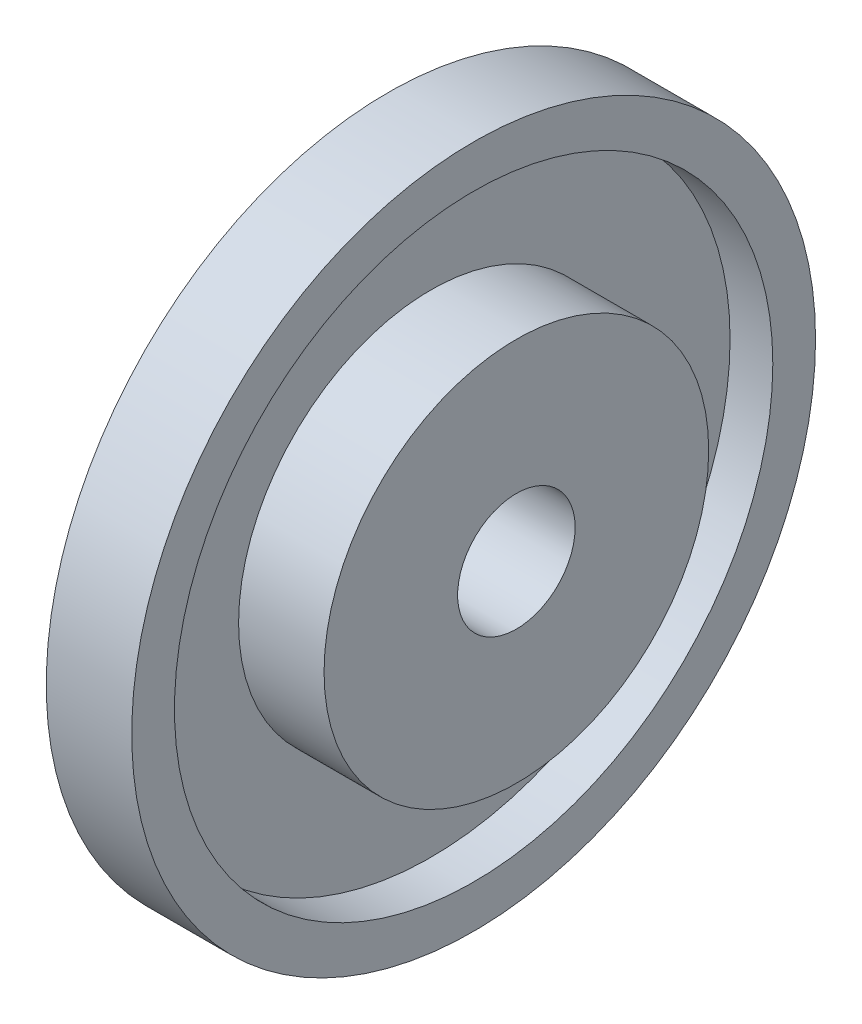
ISO-10303-21;
HEADER;
FILE_DESCRIPTION(('STEP AP214'),'2;1');
FILE_NAME('part.step','',(''),(''),'','','');
FILE_SCHEMA(('AUTOMOTIVE_DESIGN { 1 0 10303 214 1 1 1 1 }'));
ENDSEC;
DATA;
#1=APPLICATION_CONTEXT('core data for automotive mechanical design processes');
#2=APPLICATION_PROTOCOL_DEFINITION('international standard','automotive_design',2000,#1);
#3=PRODUCT_CONTEXT('',#1,'mechanical');
#4=PRODUCT('Part','Part','',(#3));
#5=PRODUCT_RELATED_PRODUCT_CATEGORY('part','',(#4));
#6=PRODUCT_DEFINITION_FORMATION('','',#4);
#7=PRODUCT_DEFINITION_CONTEXT('part definition',#1,'design');
#8=PRODUCT_DEFINITION('design','',#6,#7);
#9=PRODUCT_DEFINITION_SHAPE('','',#8);
#10=(LENGTH_UNIT() NAMED_UNIT(*) SI_UNIT(.MILLI.,.METRE.));
#11=(NAMED_UNIT(*) PLANE_ANGLE_UNIT() SI_UNIT($,.RADIAN.));
#12=(NAMED_UNIT(*) SI_UNIT($,.STERADIAN.) SOLID_ANGLE_UNIT());
#13=UNCERTAINTY_MEASURE_WITH_UNIT(LENGTH_MEASURE(1.E-05),#10,'distance_accuracy_value','');
#14=(GEOMETRIC_REPRESENTATION_CONTEXT(3) GLOBAL_UNCERTAINTY_ASSIGNED_CONTEXT((#13)) GLOBAL_UNIT_ASSIGNED_CONTEXT((#10,
#11,#12)) REPRESENTATION_CONTEXT('',''));
#15=CARTESIAN_POINT('',(0.,0.,0.));
#16=DIRECTION('',(0.,0.,1.));
#17=DIRECTION('',(1.,0.,0.));
#18=AXIS2_PLACEMENT_3D('',#15,#16,#17);
#19=CARTESIAN_POINT('',(2.,0.,0.));
#20=DIRECTION('',(1.,0.,0.));
#21=DIRECTION('',(0.,0.,-1.));
#22=AXIS2_PLACEMENT_3D('',#19,#20,#21);
#23=PLANE('',#22);
#24=CARTESIAN_POINT('',(2.,0.,0.));
#25=DIRECTION('',(1.,0.,0.));
#26=DIRECTION('',(0.,0.,-1.));
#27=AXIS2_PLACEMENT_3D('',#24,#25,#26);
#28=CIRCLE('',#27,9.);
#29=CARTESIAN_POINT('',(2.,0.,-9.));
#30=VERTEX_POINT('',#29);
#31=EDGE_CURVE('E53',#30,#30,#28,.T.);
#32=ORIENTED_EDGE('',*,*,#31,.F.);
#33=EDGE_LOOP('',(#32));
#34=FACE_BOUND('',#33,.T.);
#35=CARTESIAN_POINT('',(2.,0.,0.));
#36=DIRECTION('',(1.,0.,0.));
#37=DIRECTION('',(0.,0.,-1.));
#38=AXIS2_PLACEMENT_3D('',#35,#36,#37);
#39=CIRCLE('',#38,14.);
#40=CARTESIAN_POINT('',(2.,0.,-14.));
#41=VERTEX_POINT('',#40);
#42=EDGE_CURVE('E58',#41,#41,#39,.F.);
#43=ORIENTED_EDGE('',*,*,#42,.F.);
#44=EDGE_LOOP('',(#43));
#45=FACE_BOUND('',#44,.T.);
#46=ADVANCED_FACE('F39',(#34,#45),#23,.T.);
#47=CARTESIAN_POINT('',(0.,0.,0.));
#48=DIRECTION('',(1.,0.,0.));
#49=DIRECTION('',(0.,0.,-1.));
#50=AXIS2_PLACEMENT_3D('',#47,#48,#49);
#51=PLANE('',#50);
#52=CARTESIAN_POINT('',(0.,0.,0.));
#53=DIRECTION('',(1.,0.,0.));
#54=DIRECTION('',(0.,0.,-1.));
#55=AXIS2_PLACEMENT_3D('',#52,#53,#54);
#56=CIRCLE('',#55,6.21410161513776);
#57=CARTESIAN_POINT('',(0.,0.,-6.21410161513776));
#58=VERTEX_POINT('',#57);
#59=EDGE_CURVE('E48',#58,#58,#56,.T.);
#60=ORIENTED_EDGE('',*,*,#59,.T.);
#61=EDGE_LOOP('',(#60));
#62=FACE_BOUND('',#61,.T.);
#63=CARTESIAN_POINT('',(0.,0.,0.));
#64=DIRECTION('',(1.,0.,0.));
#65=DIRECTION('',(0.,0.,-1.));
#66=AXIS2_PLACEMENT_3D('',#63,#64,#65);
#67=CIRCLE('',#66,16.);
#68=CARTESIAN_POINT('',(0.,0.,-16.));
#69=VERTEX_POINT('',#68);
#70=EDGE_CURVE('E65',#69,#69,#67,.T.);
#71=ORIENTED_EDGE('',*,*,#70,.F.);
#72=EDGE_LOOP('',(#71));
#73=FACE_BOUND('',#72,.T.);
#74=ADVANCED_FACE('F103',(#62,#73),#51,.F.);
#75=CARTESIAN_POINT('',(4.,0.,0.));
#76=DIRECTION('',(-1.,0.,0.));
#77=DIRECTION('',(0.,0.,1.));
#78=AXIS2_PLACEMENT_3D('',#75,#76,#77);
#79=CYLINDRICAL_SURFACE('',#78,14.);
#80=ORIENTED_EDGE('',*,*,#42,.T.);
#81=EDGE_LOOP('',(#80));
#82=FACE_BOUND('',#81,.T.);
#83=CARTESIAN_POINT('',(4.,0.,0.));
#84=DIRECTION('',(1.,0.,0.));
#85=DIRECTION('',(0.,0.,-1.));
#86=AXIS2_PLACEMENT_3D('',#83,#84,#85);
#87=CIRCLE('',#86,14.);
#88=CARTESIAN_POINT('',(4.,0.,-14.));
#89=VERTEX_POINT('',#88);
#90=EDGE_CURVE('E69',#89,#89,#87,.T.);
#91=ORIENTED_EDGE('',*,*,#90,.T.);
#92=EDGE_LOOP('',(#91));
#93=FACE_BOUND('',#92,.T.);
#94=ADVANCED_FACE('F109',(#82,#93),#79,.F.);
#95=CARTESIAN_POINT('',(4.,0.,0.));
#96=DIRECTION('',(-1.,0.,0.));
#97=DIRECTION('',(0.,0.,1.));
#98=AXIS2_PLACEMENT_3D('',#95,#96,#97);
#99=CYLINDRICAL_SURFACE('',#98,16.);
#100=CARTESIAN_POINT('',(4.,0.,0.));
#101=DIRECTION('',(1.,0.,0.));
#102=DIRECTION('',(0.,0.,-1.));
#103=AXIS2_PLACEMENT_3D('',#100,#101,#102);
#104=CIRCLE('',#103,16.);
#105=CARTESIAN_POINT('',(4.,0.,-16.));
#106=VERTEX_POINT('',#105);
#107=EDGE_CURVE('E64',#106,#106,#104,.T.);
#108=ORIENTED_EDGE('',*,*,#107,.F.);
#109=EDGE_LOOP('',(#108));
#110=FACE_BOUND('',#109,.T.);
#111=ORIENTED_EDGE('',*,*,#70,.T.);
#112=EDGE_LOOP('',(#111));
#113=FACE_BOUND('',#112,.T.);
#114=ADVANCED_FACE('F115',(#110,#113),#99,.T.);
#115=CARTESIAN_POINT('',(4.,0.,0.));
#116=DIRECTION('',(1.,0.,0.));
#117=DIRECTION('',(0.,0.,-1.));
#118=AXIS2_PLACEMENT_3D('',#115,#116,#117);
#119=PLANE('',#118);
#120=ORIENTED_EDGE('',*,*,#90,.F.);
#121=EDGE_LOOP('',(#120));
#122=FACE_BOUND('',#121,.T.);
#123=ORIENTED_EDGE('',*,*,#107,.T.);
#124=EDGE_LOOP('',(#123));
#125=FACE_BOUND('',#124,.T.);
#126=ADVANCED_FACE('F100',(#122,#125),#119,.T.);
#127=CARTESIAN_POINT('',(6.,0.,0.));
#128=DIRECTION('',(-1.,0.,0.));
#129=DIRECTION('',(0.,0.,1.));
#130=AXIS2_PLACEMENT_3D('',#127,#128,#129);
#131=CYLINDRICAL_SURFACE('',#130,2.75);
#132=CARTESIAN_POINT('',(2.00000000000001,0.,0.));
#133=DIRECTION('',(1.,0.,0.));
#134=DIRECTION('',(0.,0.,-1.));
#135=AXIS2_PLACEMENT_3D('',#132,#133,#134);
#136=CIRCLE('',#135,2.75);
#137=CARTESIAN_POINT('',(2.00000000000001,0.,-2.75));
#138=VERTEX_POINT('',#137);
#139=EDGE_CURVE('E10',#138,#138,#136,.F.);
#140=ORIENTED_EDGE('',*,*,#139,.T.);
#141=EDGE_LOOP('',(#140));
#142=FACE_BOUND('',#141,.T.);
#143=CARTESIAN_POINT('',(6.,0.,0.));
#144=DIRECTION('',(1.,0.,0.));
#145=DIRECTION('',(0.,0.,-1.));
#146=AXIS2_PLACEMENT_3D('',#143,#144,#145);
#147=CIRCLE('',#146,2.75);
#148=CARTESIAN_POINT('',(6.,0.,-2.75));
#149=VERTEX_POINT('',#148);
#150=EDGE_CURVE('E80',#149,#149,#147,.T.);
#151=ORIENTED_EDGE('',*,*,#150,.T.);
#152=EDGE_LOOP('',(#151));
#153=FACE_BOUND('',#152,.T.);
#154=ADVANCED_FACE('F85',(#142,#153),#131,.F.);
#155=CARTESIAN_POINT('',(6.,0.,0.));
#156=DIRECTION('',(-1.,0.,0.));
#157=DIRECTION('',(0.,0.,1.));
#158=AXIS2_PLACEMENT_3D('',#155,#156,#157);
#159=CYLINDRICAL_SURFACE('',#158,9.);
#160=ORIENTED_EDGE('',*,*,#31,.T.);
#161=EDGE_LOOP('',(#160));
#162=FACE_BOUND('',#161,.T.);
#163=CARTESIAN_POINT('',(6.,0.,0.));
#164=DIRECTION('',(1.,0.,0.));
#165=DIRECTION('',(0.,0.,-1.));
#166=AXIS2_PLACEMENT_3D('',#163,#164,#165);
#167=CIRCLE('',#166,9.);
#168=CARTESIAN_POINT('',(6.,0.,-9.));
#169=VERTEX_POINT('',#168);
#170=EDGE_CURVE('E70',#169,#169,#167,.T.);
#171=ORIENTED_EDGE('',*,*,#170,.F.);
#172=EDGE_LOOP('',(#171));
#173=FACE_BOUND('',#172,.T.);
#174=ADVANCED_FACE('F90',(#162,#173),#159,.T.);
#175=CARTESIAN_POINT('',(6.,0.,0.));
#176=DIRECTION('',(1.,0.,0.));
#177=DIRECTION('',(0.,0.,-1.));
#178=AXIS2_PLACEMENT_3D('',#175,#176,#177);
#179=PLANE('',#178);
#180=ORIENTED_EDGE('',*,*,#150,.F.);
#181=EDGE_LOOP('',(#180));
#182=FACE_BOUND('',#181,.T.);
#183=ORIENTED_EDGE('',*,*,#170,.T.);
#184=EDGE_LOOP('',(#183));
#185=FACE_BOUND('',#184,.T.);
#186=ADVANCED_FACE('F87',(#182,#185),#179,.T.);
#187=CARTESIAN_POINT('',(0.,0.,0.));
#188=DIRECTION('',(-1.,0.,0.));
#189=DIRECTION('',(0.,0.,1.));
#190=AXIS2_PLACEMENT_3D('',#187,#188,#189);
#191=CONICAL_SURFACE('',#190,6.21410161513776,1.0471975511966);
#192=ORIENTED_EDGE('',*,*,#139,.F.);
#193=EDGE_LOOP('',(#192));
#194=FACE_BOUND('',#193,.T.);
#195=ORIENTED_EDGE('',*,*,#59,.F.);
#196=EDGE_LOOP('',(#195));
#197=FACE_BOUND('',#196,.T.);
#198=ADVANCED_FACE('F42',(#194,#197),#191,.F.);
#199=CLOSED_SHELL('',(#46,#74,#94,#114,#126,#154,#174,#186,#198));
#200=MANIFOLD_SOLID_BREP('B2',#199);
#201=ADVANCED_BREP_SHAPE_REPRESENTATION('',(#18,#200),#14);
#202=SHAPE_DEFINITION_REPRESENTATION(#9,#201);
ENDSEC;
END-ISO-10303-21;
